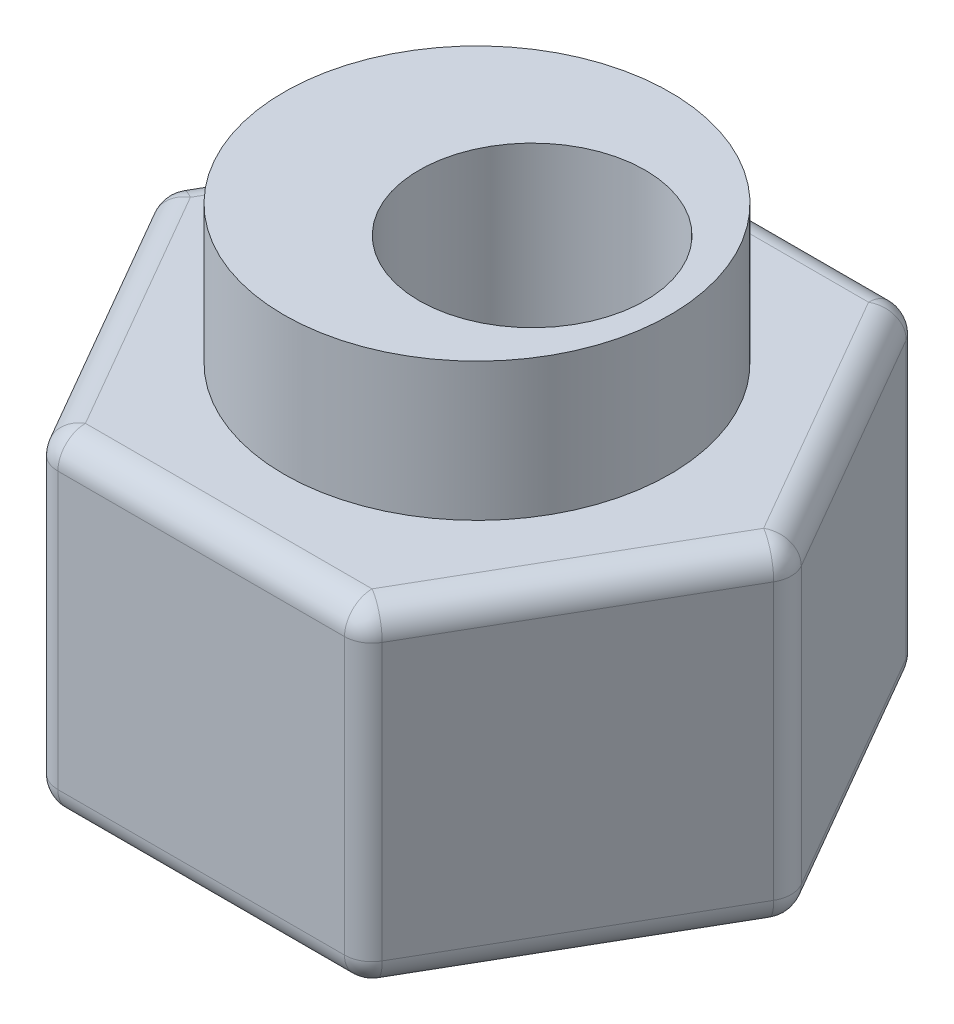
ISO-10303-21;
HEADER;
FILE_DESCRIPTION(('STEP AP214'),'2;1');
FILE_NAME('part.step','',(''),(''),'','','');
FILE_SCHEMA(('AUTOMOTIVE_DESIGN { 1 0 10303 214 1 1 1 1 }'));
ENDSEC;
DATA;
#1=APPLICATION_CONTEXT('core data for automotive mechanical design processes');
#2=APPLICATION_PROTOCOL_DEFINITION('international standard','automotive_design',2000,#1);
#3=PRODUCT_CONTEXT('',#1,'mechanical');
#4=PRODUCT('Part','Part','',(#3));
#5=PRODUCT_RELATED_PRODUCT_CATEGORY('part','',(#4));
#6=PRODUCT_DEFINITION_FORMATION('','',#4);
#7=PRODUCT_DEFINITION_CONTEXT('part definition',#1,'design');
#8=PRODUCT_DEFINITION('design','',#6,#7);
#9=PRODUCT_DEFINITION_SHAPE('','',#8);
#10=(LENGTH_UNIT() NAMED_UNIT(*) SI_UNIT(.MILLI.,.METRE.));
#11=(NAMED_UNIT(*) PLANE_ANGLE_UNIT() SI_UNIT($,.RADIAN.));
#12=(NAMED_UNIT(*) SI_UNIT($,.STERADIAN.) SOLID_ANGLE_UNIT());
#13=UNCERTAINTY_MEASURE_WITH_UNIT(LENGTH_MEASURE(1.E-05),#10,'distance_accuracy_value','');
#14=(GEOMETRIC_REPRESENTATION_CONTEXT(3) GLOBAL_UNCERTAINTY_ASSIGNED_CONTEXT((#13)) GLOBAL_UNIT_ASSIGNED_CONTEXT((#10,
#11,#12)) REPRESENTATION_CONTEXT('',''));
#15=CARTESIAN_POINT('',(0.,0.,0.));
#16=DIRECTION('',(0.,0.,1.));
#17=DIRECTION('',(1.,0.,0.));
#18=AXIS2_PLACEMENT_3D('',#15,#16,#17);
#19=CARTESIAN_POINT('',(2.88675134594813,6.,-5.));
#20=DIRECTION('',(0.,0.,1.));
#21=DIRECTION('',(1.,0.,0.));
#22=AXIS2_PLACEMENT_3D('',#19,#20,#21);
#23=PLANE('',#22);
#24=DIRECTION('',(0.,-1.,0.));
#25=VECTOR('',#24,1.);
#26=CARTESIAN_POINT('',(-2.59807621135332,6.,-5.));
#27=LINE('',#26,#25);
#28=CARTESIAN_POINT('',(-2.59807621135332,0.5,-5.));
#29=VERTEX_POINT('',#28);
#30=CARTESIAN_POINT('',(-2.59807621135332,5.5,-5.));
#31=VERTEX_POINT('',#30);
#32=EDGE_CURVE('E226',#29,#31,#27,.F.);
#33=ORIENTED_EDGE('',*,*,#32,.T.);
#34=DIRECTION('',(-1.,0.,0.));
#35=VECTOR('',#34,1.);
#36=CARTESIAN_POINT('',(2.88675134594813,5.5,-5.));
#37=LINE('',#36,#35);
#38=CARTESIAN_POINT('',(2.59807621135332,5.5,-5.));
#39=VERTEX_POINT('',#38);
#40=EDGE_CURVE('E229',#31,#39,#37,.F.);
#41=ORIENTED_EDGE('',*,*,#40,.T.);
#42=DIRECTION('',(0.,-1.,0.));
#43=VECTOR('',#42,1.);
#44=CARTESIAN_POINT('',(2.59807621135332,6.,-5.));
#45=LINE('',#44,#43);
#46=CARTESIAN_POINT('',(2.59807621135332,0.5,-5.));
#47=VERTEX_POINT('',#46);
#48=EDGE_CURVE('E224',#39,#47,#45,.T.);
#49=ORIENTED_EDGE('',*,*,#48,.T.);
#50=DIRECTION('',(-1.,0.,0.));
#51=VECTOR('',#50,1.);
#52=CARTESIAN_POINT('',(2.88675134594813,0.5,-5.));
#53=LINE('',#52,#51);
#54=EDGE_CURVE('E222',#47,#29,#53,.T.);
#55=ORIENTED_EDGE('',*,*,#54,.T.);
#56=EDGE_LOOP('',(#33,#41,#49,#55));
#57=FACE_BOUND('',#56,.T.);
#58=ADVANCED_FACE('F33',(#57),#23,.F.);
#59=CARTESIAN_POINT('',(-2.88675134594813,6.,-5.));
#60=DIRECTION('',(0.866025403784438,0.,0.5));
#61=DIRECTION('',(0.5,0.,-0.866025403784438));
#62=AXIS2_PLACEMENT_3D('',#59,#60,#61);
#63=PLANE('',#62);
#64=DIRECTION('',(0.,-1.,0.));
#65=VECTOR('',#64,1.);
#66=CARTESIAN_POINT('',(-5.62916512459886,6.,-0.250000000000002));
#67=LINE('',#66,#65);
#68=CARTESIAN_POINT('',(-5.62916512459886,0.5,-0.250000000000003));
#69=VERTEX_POINT('',#68);
#70=CARTESIAN_POINT('',(-5.62916512459886,5.5,-0.250000000000003));
#71=VERTEX_POINT('',#70);
#72=EDGE_CURVE('E217',#69,#71,#67,.F.);
#73=ORIENTED_EDGE('',*,*,#72,.T.);
#74=DIRECTION('',(-0.5,0.,0.866025403784438));
#75=VECTOR('',#74,1.);
#76=CARTESIAN_POINT('',(-2.88675134594813,5.5,-5.));
#77=LINE('',#76,#75);
#78=CARTESIAN_POINT('',(-3.03108891324554,5.5,-4.75));
#79=VERTEX_POINT('',#78);
#80=EDGE_CURVE('E220',#71,#79,#77,.F.);
#81=ORIENTED_EDGE('',*,*,#80,.T.);
#82=DIRECTION('',(0.,-1.,0.));
#83=VECTOR('',#82,1.);
#84=CARTESIAN_POINT('',(-3.03108891324554,6.,-4.75));
#85=LINE('',#84,#83);
#86=CARTESIAN_POINT('',(-3.03108891324554,0.5,-4.75));
#87=VERTEX_POINT('',#86);
#88=EDGE_CURVE('E215',#79,#87,#85,.T.);
#89=ORIENTED_EDGE('',*,*,#88,.T.);
#90=DIRECTION('',(-0.5,0.,0.866025403784438));
#91=VECTOR('',#90,1.);
#92=CARTESIAN_POINT('',(-2.88675134594813,0.5,-5.));
#93=LINE('',#92,#91);
#94=EDGE_CURVE('E213',#87,#69,#93,.T.);
#95=ORIENTED_EDGE('',*,*,#94,.T.);
#96=EDGE_LOOP('',(#73,#81,#89,#95));
#97=FACE_BOUND('',#96,.T.);
#98=ADVANCED_FACE('F388',(#97),#63,.F.);
#99=CARTESIAN_POINT('',(-5.77350269189626,6.,0.));
#100=DIRECTION('',(0.866025403784439,0.,-0.5));
#101=DIRECTION('',(-0.5,0.,-0.866025403784439));
#102=AXIS2_PLACEMENT_3D('',#99,#100,#101);
#103=PLANE('',#102);
#104=DIRECTION('',(0.,-1.,0.));
#105=VECTOR('',#104,1.);
#106=CARTESIAN_POINT('',(-3.03108891324554,6.,4.75));
#107=LINE('',#106,#105);
#108=CARTESIAN_POINT('',(-3.03108891324554,0.5,4.75));
#109=VERTEX_POINT('',#108);
#110=CARTESIAN_POINT('',(-3.03108891324554,5.5,4.75));
#111=VERTEX_POINT('',#110);
#112=EDGE_CURVE('E208',#109,#111,#107,.F.);
#113=ORIENTED_EDGE('',*,*,#112,.T.);
#114=DIRECTION('',(0.5,0.,0.866025403784439));
#115=VECTOR('',#114,1.);
#116=CARTESIAN_POINT('',(-5.77350269189626,5.5,0.));
#117=LINE('',#116,#115);
#118=CARTESIAN_POINT('',(-5.62916512459886,5.5,0.249999999999997));
#119=VERTEX_POINT('',#118);
#120=EDGE_CURVE('E211',#111,#119,#117,.F.);
#121=ORIENTED_EDGE('',*,*,#120,.T.);
#122=DIRECTION('',(0.,-1.,0.));
#123=VECTOR('',#122,1.);
#124=CARTESIAN_POINT('',(-5.62916512459886,6.,0.249999999999997));
#125=LINE('',#124,#123);
#126=CARTESIAN_POINT('',(-5.62916512459886,0.5,0.249999999999997));
#127=VERTEX_POINT('',#126);
#128=EDGE_CURVE('E206',#119,#127,#125,.T.);
#129=ORIENTED_EDGE('',*,*,#128,.T.);
#130=DIRECTION('',(0.5,0.,0.866025403784439));
#131=VECTOR('',#130,1.);
#132=CARTESIAN_POINT('',(-5.77350269189626,0.5,0.));
#133=LINE('',#132,#131);
#134=EDGE_CURVE('E204',#127,#109,#133,.T.);
#135=ORIENTED_EDGE('',*,*,#134,.T.);
#136=EDGE_LOOP('',(#113,#121,#129,#135));
#137=FACE_BOUND('',#136,.T.);
#138=ADVANCED_FACE('F395',(#137),#103,.F.);
#139=CARTESIAN_POINT('',(-2.88675134594813,6.,5.));
#140=DIRECTION('',(0.,0.,-1.));
#141=DIRECTION('',(-1.,0.,0.));
#142=AXIS2_PLACEMENT_3D('',#139,#140,#141);
#143=PLANE('',#142);
#144=DIRECTION('',(0.,-1.,0.));
#145=VECTOR('',#144,1.);
#146=CARTESIAN_POINT('',(2.59807621135332,6.,5.));
#147=LINE('',#146,#145);
#148=CARTESIAN_POINT('',(2.59807621135332,0.5,5.));
#149=VERTEX_POINT('',#148);
#150=CARTESIAN_POINT('',(2.59807621135332,5.5,5.));
#151=VERTEX_POINT('',#150);
#152=EDGE_CURVE('E164',#149,#151,#147,.F.);
#153=ORIENTED_EDGE('',*,*,#152,.T.);
#154=DIRECTION('',(1.,0.,0.));
#155=VECTOR('',#154,1.);
#156=CARTESIAN_POINT('',(-2.88675134594813,5.5,5.));
#157=LINE('',#156,#155);
#158=CARTESIAN_POINT('',(-2.59807621135332,5.5,5.));
#159=VERTEX_POINT('',#158);
#160=EDGE_CURVE('E202',#151,#159,#157,.F.);
#161=ORIENTED_EDGE('',*,*,#160,.T.);
#162=DIRECTION('',(0.,-1.,0.));
#163=VECTOR('',#162,1.);
#164=CARTESIAN_POINT('',(-2.59807621135332,6.,5.));
#165=LINE('',#164,#163);
#166=CARTESIAN_POINT('',(-2.59807621135332,0.5,5.));
#167=VERTEX_POINT('',#166);
#168=EDGE_CURVE('E199',#159,#167,#165,.T.);
#169=ORIENTED_EDGE('',*,*,#168,.T.);
#170=DIRECTION('',(1.,0.,0.));
#171=VECTOR('',#170,1.);
#172=CARTESIAN_POINT('',(-2.88675134594813,0.5,5.));
#173=LINE('',#172,#171);
#174=EDGE_CURVE('E194',#167,#149,#173,.T.);
#175=ORIENTED_EDGE('',*,*,#174,.T.);
#176=EDGE_LOOP('',(#153,#161,#169,#175));
#177=FACE_BOUND('',#176,.T.);
#178=ADVANCED_FACE('F560',(#177),#143,.F.);
#179=CARTESIAN_POINT('',(2.88675134594813,6.,5.));
#180=DIRECTION('',(-0.866025403784439,0.,-0.5));
#181=DIRECTION('',(-0.5,0.,0.866025403784439));
#182=AXIS2_PLACEMENT_3D('',#179,#180,#181);
#183=PLANE('',#182);
#184=DIRECTION('',(0.,-1.,0.));
#185=VECTOR('',#184,1.);
#186=CARTESIAN_POINT('',(5.62916512459886,6.,0.25));
#187=LINE('',#186,#185);
#188=CARTESIAN_POINT('',(5.62916512459886,0.5,0.250000000000002));
#189=VERTEX_POINT('',#188);
#190=CARTESIAN_POINT('',(5.62916512459886,5.5,0.250000000000002));
#191=VERTEX_POINT('',#190);
#192=EDGE_CURVE('E186',#189,#191,#187,.F.);
#193=ORIENTED_EDGE('',*,*,#192,.T.);
#194=DIRECTION('',(0.5,0.,-0.866025403784439));
#195=VECTOR('',#194,1.);
#196=CARTESIAN_POINT('',(2.88675134594813,5.5,5.));
#197=LINE('',#196,#195);
#198=CARTESIAN_POINT('',(3.03108891324554,5.5,4.75));
#199=VERTEX_POINT('',#198);
#200=EDGE_CURVE('E191',#191,#199,#197,.F.);
#201=ORIENTED_EDGE('',*,*,#200,.T.);
#202=DIRECTION('',(0.,-1.,0.));
#203=VECTOR('',#202,1.);
#204=CARTESIAN_POINT('',(3.03108891324554,6.,4.75));
#205=LINE('',#204,#203);
#206=CARTESIAN_POINT('',(3.03108891324554,0.5,4.75));
#207=VERTEX_POINT('',#206);
#208=EDGE_CURVE('E162',#199,#207,#205,.T.);
#209=ORIENTED_EDGE('',*,*,#208,.T.);
#210=DIRECTION('',(0.5,0.,-0.866025403784439));
#211=VECTOR('',#210,1.);
#212=CARTESIAN_POINT('',(2.88675134594813,0.5,5.));
#213=LINE('',#212,#211);
#214=EDGE_CURVE('E180',#207,#189,#213,.T.);
#215=ORIENTED_EDGE('',*,*,#214,.T.);
#216=EDGE_LOOP('',(#193,#201,#209,#215));
#217=FACE_BOUND('',#216,.T.);
#218=ADVANCED_FACE('F189',(#217),#183,.F.);
#219=CARTESIAN_POINT('',(5.77350269189626,6.,0.));
#220=DIRECTION('',(-0.866025403784439,0.,0.5));
#221=DIRECTION('',(0.5,0.,0.866025403784439));
#222=AXIS2_PLACEMENT_3D('',#219,#220,#221);
#223=PLANE('',#222);
#224=DIRECTION('',(0.,-1.,0.));
#225=VECTOR('',#224,1.);
#226=CARTESIAN_POINT('',(3.03108891324554,6.,-4.75));
#227=LINE('',#226,#225);
#228=CARTESIAN_POINT('',(3.03108891324554,0.5,-4.75));
#229=VERTEX_POINT('',#228);
#230=CARTESIAN_POINT('',(3.03108891324554,5.5,-4.75));
#231=VERTEX_POINT('',#230);
#232=EDGE_CURVE('E235',#229,#231,#227,.F.);
#233=ORIENTED_EDGE('',*,*,#232,.T.);
#234=DIRECTION('',(-0.5,0.,-0.866025403784439));
#235=VECTOR('',#234,1.);
#236=CARTESIAN_POINT('',(5.77350269189626,5.5,0.));
#237=LINE('',#236,#235);
#238=CARTESIAN_POINT('',(5.62916512459886,5.5,-0.249999999999998));
#239=VERTEX_POINT('',#238);
#240=EDGE_CURVE('E238',#231,#239,#237,.F.);
#241=ORIENTED_EDGE('',*,*,#240,.T.);
#242=DIRECTION('',(0.,-1.,0.));
#243=VECTOR('',#242,1.);
#244=CARTESIAN_POINT('',(5.62916512459886,6.,-0.249999999999998));
#245=LINE('',#244,#243);
#246=CARTESIAN_POINT('',(5.62916512459886,0.5,-0.249999999999998));
#247=VERTEX_POINT('',#246);
#248=EDGE_CURVE('E233',#239,#247,#245,.T.);
#249=ORIENTED_EDGE('',*,*,#248,.T.);
#250=DIRECTION('',(-0.5,0.,-0.866025403784439));
#251=VECTOR('',#250,1.);
#252=CARTESIAN_POINT('',(5.77350269189626,0.5,0.));
#253=LINE('',#252,#251);
#254=EDGE_CURVE('E231',#247,#229,#253,.T.);
#255=ORIENTED_EDGE('',*,*,#254,.T.);
#256=EDGE_LOOP('',(#233,#241,#249,#255));
#257=FACE_BOUND('',#256,.T.);
#258=ADVANCED_FACE('F376',(#257),#223,.F.);
#259=CARTESIAN_POINT('',(0.,6.,0.));
#260=DIRECTION('',(0.,1.,0.));
#261=DIRECTION('',(0.,0.,1.));
#262=AXIS2_PLACEMENT_3D('',#259,#260,#261);
#263=PLANE('',#262);
#264=DIRECTION('',(1.,0.,0.));
#265=VECTOR('',#264,1.);
#266=CARTESIAN_POINT('',(2.88675134594813,6.,4.5));
#267=LINE('',#266,#265);
#268=CARTESIAN_POINT('',(-2.59807621135332,6.,4.5));
#269=VERTEX_POINT('',#268);
#270=CARTESIAN_POINT('',(2.59807621135332,6.,4.5));
#271=VERTEX_POINT('',#270);
#272=EDGE_CURVE('E248',#269,#271,#267,.T.);
#273=ORIENTED_EDGE('',*,*,#272,.T.);
#274=DIRECTION('',(0.5,0.,-0.866025403784439));
#275=VECTOR('',#274,1.);
#276=CARTESIAN_POINT('',(5.34048999000404,6.,-0.249999999999998));
#277=LINE('',#276,#275);
#278=CARTESIAN_POINT('',(5.19615242270664,6.,0.));
#279=VERTEX_POINT('',#278);
#280=EDGE_CURVE('E250',#271,#279,#277,.T.);
#281=ORIENTED_EDGE('',*,*,#280,.T.);
#282=DIRECTION('',(-0.5,0.,-0.866025403784439));
#283=VECTOR('',#282,1.);
#284=CARTESIAN_POINT('',(2.45373864405591,6.,-4.75));
#285=LINE('',#284,#283);
#286=CARTESIAN_POINT('',(2.59807621135332,6.,-4.5));
#287=VERTEX_POINT('',#286);
#288=EDGE_CURVE('E240',#279,#287,#285,.T.);
#289=ORIENTED_EDGE('',*,*,#288,.T.);
#290=DIRECTION('',(-1.,0.,0.));
#291=VECTOR('',#290,1.);
#292=CARTESIAN_POINT('',(-2.88675134594813,6.,-4.5));
#293=LINE('',#292,#291);
#294=CARTESIAN_POINT('',(-2.59807621135332,6.,-4.5));
#295=VERTEX_POINT('',#294);
#296=EDGE_CURVE('E242',#287,#295,#293,.T.);
#297=ORIENTED_EDGE('',*,*,#296,.T.);
#298=DIRECTION('',(-0.5,0.,0.866025403784438));
#299=VECTOR('',#298,1.);
#300=CARTESIAN_POINT('',(-5.34048999000404,6.,0.249999999999998));
#301=LINE('',#300,#299);
#302=CARTESIAN_POINT('',(-5.19615242270664,6.,0.));
#303=VERTEX_POINT('',#302);
#304=EDGE_CURVE('E244',#295,#303,#301,.T.);
#305=ORIENTED_EDGE('',*,*,#304,.T.);
#306=DIRECTION('',(0.5,0.,0.866025403784439));
#307=VECTOR('',#306,1.);
#308=CARTESIAN_POINT('',(-2.45373864405591,6.,4.75));
#309=LINE('',#308,#307);
#310=EDGE_CURVE('E246',#303,#269,#309,.T.);
#311=ORIENTED_EDGE('',*,*,#310,.T.);
#312=EDGE_LOOP('',(#273,#281,#289,#297,#305,#311));
#313=FACE_BOUND('',#312,.T.);
#314=CARTESIAN_POINT('',(0.,6.,0.));
#315=DIRECTION('',(0.,1.,0.));
#316=DIRECTION('',(0.,0.,1.));
#317=AXIS2_PLACEMENT_3D('',#314,#315,#316);
#318=CIRCLE('',#317,3.5);
#319=CARTESIAN_POINT('',(0.,6.,3.5));
#320=VERTEX_POINT('',#319);
#321=EDGE_CURVE('E187',#320,#320,#318,.T.);
#322=ORIENTED_EDGE('',*,*,#321,.F.);
#323=EDGE_LOOP('',(#322));
#324=FACE_BOUND('',#323,.T.);
#325=ADVANCED_FACE('F373',(#313,#324),#263,.T.);
#326=CARTESIAN_POINT('',(0.,0.,0.));
#327=DIRECTION('',(0.,1.,0.));
#328=DIRECTION('',(0.,0.,1.));
#329=AXIS2_PLACEMENT_3D('',#326,#327,#328);
#330=PLANE('',#329);
#331=DIRECTION('',(-0.5,0.,0.866025403784438));
#332=VECTOR('',#331,1.);
#333=CARTESIAN_POINT('',(-3.89711431702998,0.,-2.25));
#334=LINE('',#333,#332);
#335=CARTESIAN_POINT('',(-5.19615242270664,0.,0.));
#336=VERTEX_POINT('',#335);
#337=CARTESIAN_POINT('',(-2.59807621135332,0.,-4.5));
#338=VERTEX_POINT('',#337);
#339=EDGE_CURVE('E42',#336,#338,#334,.F.);
#340=ORIENTED_EDGE('',*,*,#339,.T.);
#341=DIRECTION('',(-1.,0.,0.));
#342=VECTOR('',#341,1.);
#343=CARTESIAN_POINT('',(0.,0.,-4.5));
#344=LINE('',#343,#342);
#345=CARTESIAN_POINT('',(2.59807621135332,0.,-4.5));
#346=VERTEX_POINT('',#345);
#347=EDGE_CURVE('E11',#338,#346,#344,.F.);
#348=ORIENTED_EDGE('',*,*,#347,.T.);
#349=DIRECTION('',(-0.5,0.,-0.866025403784439));
#350=VECTOR('',#349,1.);
#351=CARTESIAN_POINT('',(3.89711431702998,0.,-2.25));
#352=LINE('',#351,#350);
#353=CARTESIAN_POINT('',(5.19615242270664,0.,0.));
#354=VERTEX_POINT('',#353);
#355=EDGE_CURVE('E253',#346,#354,#352,.F.);
#356=ORIENTED_EDGE('',*,*,#355,.T.);
#357=DIRECTION('',(0.5,0.,-0.866025403784439));
#358=VECTOR('',#357,1.);
#359=CARTESIAN_POINT('',(3.89711431702998,0.,2.25));
#360=LINE('',#359,#358);
#361=CARTESIAN_POINT('',(2.59807621135332,0.,4.5));
#362=VERTEX_POINT('',#361);
#363=EDGE_CURVE('E255',#354,#362,#360,.F.);
#364=ORIENTED_EDGE('',*,*,#363,.T.);
#365=DIRECTION('',(1.,0.,0.));
#366=VECTOR('',#365,1.);
#367=CARTESIAN_POINT('',(0.,0.,4.5));
#368=LINE('',#367,#366);
#369=CARTESIAN_POINT('',(-2.59807621135332,0.,4.5));
#370=VERTEX_POINT('',#369);
#371=EDGE_CURVE('E257',#362,#370,#368,.F.);
#372=ORIENTED_EDGE('',*,*,#371,.T.);
#373=DIRECTION('',(0.5,0.,0.866025403784439));
#374=VECTOR('',#373,1.);
#375=CARTESIAN_POINT('',(-3.89711431702998,0.,2.25));
#376=LINE('',#375,#374);
#377=EDGE_CURVE('E53',#370,#336,#376,.F.);
#378=ORIENTED_EDGE('',*,*,#377,.T.);
#379=EDGE_LOOP('',(#340,#348,#356,#364,#372,#378));
#380=FACE_BOUND('',#379,.T.);
#381=CARTESIAN_POINT('',(1.,0.,0.));
#382=DIRECTION('',(0.,1.,0.));
#383=DIRECTION('',(0.,0.,1.));
#384=AXIS2_PLACEMENT_3D('',#381,#382,#383);
#385=CIRCLE('',#384,2.05);
#386=CARTESIAN_POINT('',(1.,0.,2.05));
#387=VERTEX_POINT('',#386);
#388=EDGE_CURVE('E358',#387,#387,#385,.T.);
#389=ORIENTED_EDGE('',*,*,#388,.T.);
#390=EDGE_LOOP('',(#389));
#391=FACE_BOUND('',#390,.T.);
#392=ADVANCED_FACE('F375',(#380,#391),#330,.F.);
#393=CARTESIAN_POINT('',(0.,8.5,0.));
#394=DIRECTION('',(0.,-1.,0.));
#395=DIRECTION('',(0.,0.,-1.));
#396=AXIS2_PLACEMENT_3D('',#393,#394,#395);
#397=CYLINDRICAL_SURFACE('',#396,3.5);
#398=CARTESIAN_POINT('',(0.,8.5,0.));
#399=DIRECTION('',(0.,1.,0.));
#400=DIRECTION('',(0.,0.,1.));
#401=AXIS2_PLACEMENT_3D('',#398,#399,#400);
#402=CIRCLE('',#401,3.5);
#403=CARTESIAN_POINT('',(0.,8.5,3.5));
#404=VERTEX_POINT('',#403);
#405=EDGE_CURVE('E363',#404,#404,#402,.T.);
#406=ORIENTED_EDGE('',*,*,#405,.F.);
#407=EDGE_LOOP('',(#406));
#408=FACE_BOUND('',#407,.T.);
#409=ORIENTED_EDGE('',*,*,#321,.T.);
#410=EDGE_LOOP('',(#409));
#411=FACE_BOUND('',#410,.T.);
#412=ADVANCED_FACE('F371',(#408,#411),#397,.T.);
#413=CARTESIAN_POINT('',(0.,8.5,0.));
#414=DIRECTION('',(0.,1.,0.));
#415=DIRECTION('',(0.,0.,1.));
#416=AXIS2_PLACEMENT_3D('',#413,#414,#415);
#417=PLANE('',#416);
#418=CARTESIAN_POINT('',(1.,8.5,0.));
#419=DIRECTION('',(0.,1.,0.));
#420=DIRECTION('',(0.,0.,1.));
#421=AXIS2_PLACEMENT_3D('',#418,#419,#420);
#422=CIRCLE('',#421,2.05);
#423=CARTESIAN_POINT('',(1.,8.5,2.05));
#424=VERTEX_POINT('',#423);
#425=EDGE_CURVE('E352',#424,#424,#422,.T.);
#426=ORIENTED_EDGE('',*,*,#425,.F.);
#427=EDGE_LOOP('',(#426));
#428=FACE_BOUND('',#427,.T.);
#429=ORIENTED_EDGE('',*,*,#405,.T.);
#430=EDGE_LOOP('',(#429));
#431=FACE_BOUND('',#430,.T.);
#432=ADVANCED_FACE('F600',(#428,#431),#417,.T.);
#433=CARTESIAN_POINT('',(1.,0.,0.));
#434=DIRECTION('',(0.,1.,0.));
#435=DIRECTION('',(0.,0.,1.));
#436=AXIS2_PLACEMENT_3D('',#433,#434,#435);
#437=CYLINDRICAL_SURFACE('',#436,2.05);
#438=ORIENTED_EDGE('',*,*,#388,.F.);
#439=EDGE_LOOP('',(#438));
#440=FACE_BOUND('',#439,.T.);
#441=ORIENTED_EDGE('',*,*,#425,.T.);
#442=EDGE_LOOP('',(#441));
#443=FACE_BOUND('',#442,.T.);
#444=ADVANCED_FACE('F509',(#440,#443),#437,.F.);
#445=CARTESIAN_POINT('',(-2.59807621135332,6.,-4.5));
#446=DIRECTION('',(0.,-1.,0.));
#447=DIRECTION('',(0.,0.,-1.));
#448=AXIS2_PLACEMENT_3D('',#445,#446,#447);
#449=CYLINDRICAL_SURFACE('',#448,0.5);
#450=CARTESIAN_POINT('',(-2.59807621135332,5.5,-4.5));
#451=DIRECTION('',(0.,1.,0.));
#452=DIRECTION('',(0.,0.,1.));
#453=AXIS2_PLACEMENT_3D('',#450,#451,#452);
#454=CIRCLE('',#453,0.5);
#455=EDGE_CURVE('E37',#31,#79,#454,.T.);
#456=ORIENTED_EDGE('',*,*,#455,.F.);
#457=ORIENTED_EDGE('',*,*,#32,.F.);
#458=CARTESIAN_POINT('',(-2.59807621135332,0.5,-4.5));
#459=DIRECTION('',(0.,-1.,0.));
#460=DIRECTION('',(0.,0.,-1.));
#461=AXIS2_PLACEMENT_3D('',#458,#459,#460);
#462=CIRCLE('',#461,0.5);
#463=EDGE_CURVE('E345',#87,#29,#462,.T.);
#464=ORIENTED_EDGE('',*,*,#463,.F.);
#465=ORIENTED_EDGE('',*,*,#88,.F.);
#466=EDGE_LOOP('',(#456,#457,#464,#465));
#467=FACE_BOUND('',#466,.T.);
#468=ADVANCED_FACE('F35',(#467),#449,.T.);
#469=CARTESIAN_POINT('',(-2.59807621135332,5.5,-4.5));
#470=DIRECTION('',(0.,0.,1.));
#471=DIRECTION('',(1.,0.,0.));
#472=AXIS2_PLACEMENT_3D('',#469,#470,#471);
#473=SPHERICAL_SURFACE('',#472,0.5);
#474=CARTESIAN_POINT('',(-2.59807621135332,5.5,-4.5));
#475=DIRECTION('',(-1.,0.,0.));
#476=DIRECTION('',(0.,0.,1.));
#477=AXIS2_PLACEMENT_3D('',#474,#475,#476);
#478=CIRCLE('',#477,0.5);
#479=EDGE_CURVE('E340',#31,#295,#478,.F.);
#480=ORIENTED_EDGE('',*,*,#479,.F.);
#481=ORIENTED_EDGE('',*,*,#455,.T.);
#482=CARTESIAN_POINT('',(-2.59807621135332,5.5,-4.5));
#483=DIRECTION('',(0.500000000000001,0.,-0.866025403784438));
#484=DIRECTION('',(-0.866025403784438,0.,-0.500000000000001));
#485=AXIS2_PLACEMENT_3D('',#482,#483,#484);
#486=CIRCLE('',#485,0.5);
#487=EDGE_CURVE('E343',#295,#79,#486,.F.);
#488=ORIENTED_EDGE('',*,*,#487,.F.);
#489=EDGE_LOOP('',(#480,#481,#488));
#490=FACE_BOUND('',#489,.T.);
#491=ADVANCED_FACE('F504',(#490),#473,.T.);
#492=CARTESIAN_POINT('',(-2.59807621135332,0.5,-4.5));
#493=DIRECTION('',(0.,0.,1.));
#494=DIRECTION('',(1.,0.,0.));
#495=AXIS2_PLACEMENT_3D('',#492,#493,#494);
#496=SPHERICAL_SURFACE('',#495,0.5);
#497=CARTESIAN_POINT('',(-2.59807621135332,0.5,-4.5));
#498=DIRECTION('',(0.5,0.,-0.866025403784438));
#499=DIRECTION('',(-0.866025403784438,0.,-0.5));
#500=AXIS2_PLACEMENT_3D('',#497,#498,#499);
#501=CIRCLE('',#500,0.5);
#502=EDGE_CURVE('E335',#87,#338,#501,.F.);
#503=ORIENTED_EDGE('',*,*,#502,.F.);
#504=ORIENTED_EDGE('',*,*,#463,.T.);
#505=CARTESIAN_POINT('',(-2.59807621135332,0.5,-4.5));
#506=DIRECTION('',(-1.,0.,0.));
#507=DIRECTION('',(0.,0.,1.));
#508=AXIS2_PLACEMENT_3D('',#505,#506,#507);
#509=CIRCLE('',#508,0.5);
#510=EDGE_CURVE('E337',#338,#29,#509,.F.);
#511=ORIENTED_EDGE('',*,*,#510,.F.);
#512=EDGE_LOOP('',(#503,#504,#511));
#513=FACE_BOUND('',#512,.T.);
#514=ADVANCED_FACE('F501',(#513),#496,.T.);
#515=CARTESIAN_POINT('',(-3.89711431702998,5.5,-2.25));
#516=DIRECTION('',(0.5,0.,-0.866025403784438));
#517=DIRECTION('',(-0.866025403784438,0.,-0.5));
#518=AXIS2_PLACEMENT_3D('',#515,#516,#517);
#519=CYLINDRICAL_SURFACE('',#518,0.5);
#520=ORIENTED_EDGE('',*,*,#487,.T.);
#521=ORIENTED_EDGE('',*,*,#80,.F.);
#522=CARTESIAN_POINT('',(-5.19615242270664,5.5,0.));
#523=DIRECTION('',(-0.499999999999998,0.,0.86602540378444));
#524=DIRECTION('',(0.86602540378444,0.,0.499999999999998));
#525=AXIS2_PLACEMENT_3D('',#522,#523,#524);
#526=CIRCLE('',#525,0.5);
#527=EDGE_CURVE('E330',#303,#71,#526,.T.);
#528=ORIENTED_EDGE('',*,*,#527,.F.);
#529=ORIENTED_EDGE('',*,*,#304,.F.);
#530=EDGE_LOOP('',(#520,#521,#528,#529));
#531=FACE_BOUND('',#530,.T.);
#532=ADVANCED_FACE('F497',(#531),#519,.T.);
#533=CARTESIAN_POINT('',(0.,5.5,-4.5));
#534=DIRECTION('',(1.,0.,0.));
#535=DIRECTION('',(0.,0.,-1.));
#536=AXIS2_PLACEMENT_3D('',#533,#534,#535);
#537=CYLINDRICAL_SURFACE('',#536,0.5);
#538=ORIENTED_EDGE('',*,*,#479,.T.);
#539=ORIENTED_EDGE('',*,*,#296,.F.);
#540=CARTESIAN_POINT('',(2.59807621135332,5.5,-4.5));
#541=DIRECTION('',(1.,0.,0.));
#542=DIRECTION('',(0.,0.,-1.));
#543=AXIS2_PLACEMENT_3D('',#540,#541,#542);
#544=CIRCLE('',#543,0.5);
#545=EDGE_CURVE('E327',#39,#287,#544,.T.);
#546=ORIENTED_EDGE('',*,*,#545,.F.);
#547=ORIENTED_EDGE('',*,*,#40,.F.);
#548=EDGE_LOOP('',(#538,#539,#546,#547));
#549=FACE_BOUND('',#548,.T.);
#550=ADVANCED_FACE('F493',(#549),#537,.T.);
#551=CARTESIAN_POINT('',(2.59807621135332,6.,-4.5));
#552=DIRECTION('',(0.,-1.,0.));
#553=DIRECTION('',(0.,0.,-1.));
#554=AXIS2_PLACEMENT_3D('',#551,#552,#553);
#555=CYLINDRICAL_SURFACE('',#554,0.5);
#556=CARTESIAN_POINT('',(2.59807621135332,0.5,-4.5));
#557=DIRECTION('',(0.,-1.,0.));
#558=DIRECTION('',(0.,0.,-1.));
#559=AXIS2_PLACEMENT_3D('',#556,#557,#558);
#560=CIRCLE('',#559,0.5);
#561=EDGE_CURVE('E321',#47,#229,#560,.T.);
#562=ORIENTED_EDGE('',*,*,#561,.F.);
#563=ORIENTED_EDGE('',*,*,#48,.F.);
#564=CARTESIAN_POINT('',(2.59807621135332,5.5,-4.5));
#565=DIRECTION('',(0.,1.,0.));
#566=DIRECTION('',(0.,0.,1.));
#567=AXIS2_PLACEMENT_3D('',#564,#565,#566);
#568=CIRCLE('',#567,0.5);
#569=EDGE_CURVE('E324',#231,#39,#568,.T.);
#570=ORIENTED_EDGE('',*,*,#569,.F.);
#571=ORIENTED_EDGE('',*,*,#232,.F.);
#572=EDGE_LOOP('',(#562,#563,#570,#571));
#573=FACE_BOUND('',#572,.T.);
#574=ADVANCED_FACE('F489',(#573),#555,.T.);
#575=CARTESIAN_POINT('',(2.88675134594813,0.5,-4.5));
#576=DIRECTION('',(-1.,0.,0.));
#577=DIRECTION('',(0.,0.,1.));
#578=AXIS2_PLACEMENT_3D('',#575,#576,#577);
#579=CYLINDRICAL_SURFACE('',#578,0.5);
#580=ORIENTED_EDGE('',*,*,#510,.T.);
#581=ORIENTED_EDGE('',*,*,#54,.F.);
#582=CARTESIAN_POINT('',(2.59807621135332,0.5,-4.5));
#583=DIRECTION('',(1.,0.,0.));
#584=DIRECTION('',(0.,0.,-1.));
#585=AXIS2_PLACEMENT_3D('',#582,#583,#584);
#586=CIRCLE('',#585,0.5);
#587=EDGE_CURVE('E318',#346,#47,#586,.T.);
#588=ORIENTED_EDGE('',*,*,#587,.F.);
#589=ORIENTED_EDGE('',*,*,#347,.F.);
#590=EDGE_LOOP('',(#580,#581,#588,#589));
#591=FACE_BOUND('',#590,.T.);
#592=ADVANCED_FACE('F485',(#591),#579,.T.);
#593=CARTESIAN_POINT('',(-2.45373864405591,0.5,-4.75));
#594=DIRECTION('',(-0.5,0.,0.866025403784438));
#595=DIRECTION('',(0.866025403784438,0.,0.5));
#596=AXIS2_PLACEMENT_3D('',#593,#594,#595);
#597=CYLINDRICAL_SURFACE('',#596,0.5);
#598=ORIENTED_EDGE('',*,*,#502,.T.);
#599=ORIENTED_EDGE('',*,*,#339,.F.);
#600=CARTESIAN_POINT('',(-5.19615242270664,0.5,0.));
#601=DIRECTION('',(-0.500000000000001,0.,0.866025403784438));
#602=DIRECTION('',(0.866025403784438,0.,0.500000000000001));
#603=AXIS2_PLACEMENT_3D('',#600,#601,#602);
#604=CIRCLE('',#603,0.5);
#605=EDGE_CURVE('E315',#69,#336,#604,.T.);
#606=ORIENTED_EDGE('',*,*,#605,.F.);
#607=ORIENTED_EDGE('',*,*,#94,.F.);
#608=EDGE_LOOP('',(#598,#599,#606,#607));
#609=FACE_BOUND('',#608,.T.);
#610=ADVANCED_FACE('F481',(#609),#597,.T.);
#611=CARTESIAN_POINT('',(-5.19615242270664,6.,0.));
#612=DIRECTION('',(0.,-1.,0.));
#613=DIRECTION('',(0.,0.,-1.));
#614=AXIS2_PLACEMENT_3D('',#611,#612,#613);
#615=CYLINDRICAL_SURFACE('',#614,0.5);
#616=CARTESIAN_POINT('',(-5.19615242270664,5.5,0.));
#617=DIRECTION('',(0.,1.,0.));
#618=DIRECTION('',(0.,0.,1.));
#619=AXIS2_PLACEMENT_3D('',#616,#617,#618);
#620=CIRCLE('',#619,0.5);
#621=EDGE_CURVE('E332',#71,#119,#620,.T.);
#622=ORIENTED_EDGE('',*,*,#621,.F.);
#623=ORIENTED_EDGE('',*,*,#72,.F.);
#624=CARTESIAN_POINT('',(-5.19615242270664,0.5,0.));
#625=DIRECTION('',(0.,-1.,0.));
#626=DIRECTION('',(0.,0.,-1.));
#627=AXIS2_PLACEMENT_3D('',#624,#625,#626);
#628=CIRCLE('',#627,0.5);
#629=EDGE_CURVE('E312',#127,#69,#628,.T.);
#630=ORIENTED_EDGE('',*,*,#629,.F.);
#631=ORIENTED_EDGE('',*,*,#128,.F.);
#632=EDGE_LOOP('',(#622,#623,#630,#631));
#633=FACE_BOUND('',#632,.T.);
#634=ADVANCED_FACE('F477',(#633),#615,.T.);
#635=CARTESIAN_POINT('',(-5.19615242270664,5.5,0.));
#636=DIRECTION('',(0.,0.,1.));
#637=DIRECTION('',(1.,0.,0.));
#638=AXIS2_PLACEMENT_3D('',#635,#636,#637);
#639=SPHERICAL_SURFACE('',#638,0.5);
#640=ORIENTED_EDGE('',*,*,#527,.T.);
#641=ORIENTED_EDGE('',*,*,#621,.T.);
#642=CARTESIAN_POINT('',(-5.19615242270664,5.5,0.));
#643=DIRECTION('',(-0.5,0.,-0.866025403784439));
#644=DIRECTION('',(-0.866025403784439,0.,0.5));
#645=AXIS2_PLACEMENT_3D('',#642,#643,#644);
#646=CIRCLE('',#645,0.5);
#647=EDGE_CURVE('E309',#303,#119,#646,.F.);
#648=ORIENTED_EDGE('',*,*,#647,.F.);
#649=EDGE_LOOP('',(#640,#641,#648));
#650=FACE_BOUND('',#649,.T.);
#651=ADVANCED_FACE('F473',(#650),#639,.T.);
#652=CARTESIAN_POINT('',(2.59807621135332,5.5,-4.5));
#653=DIRECTION('',(0.,0.,1.));
#654=DIRECTION('',(1.,0.,0.));
#655=AXIS2_PLACEMENT_3D('',#652,#653,#654);
#656=SPHERICAL_SURFACE('',#655,0.5);
#657=ORIENTED_EDGE('',*,*,#569,.T.);
#658=ORIENTED_EDGE('',*,*,#545,.T.);
#659=CARTESIAN_POINT('',(2.59807621135332,5.5,-4.5));
#660=DIRECTION('',(-0.500000000000001,0.,-0.866025403784438));
#661=DIRECTION('',(-0.866025403784438,0.,0.500000000000001));
#662=AXIS2_PLACEMENT_3D('',#659,#660,#661);
#663=CIRCLE('',#662,0.5);
#664=EDGE_CURVE('E306',#231,#287,#663,.F.);
#665=ORIENTED_EDGE('',*,*,#664,.F.);
#666=EDGE_LOOP('',(#657,#658,#665));
#667=FACE_BOUND('',#666,.T.);
#668=ADVANCED_FACE('F469',(#667),#656,.T.);
#669=CARTESIAN_POINT('',(2.59807621135332,0.5,-4.5));
#670=DIRECTION('',(0.,0.,1.));
#671=DIRECTION('',(1.,0.,0.));
#672=AXIS2_PLACEMENT_3D('',#669,#670,#671);
#673=SPHERICAL_SURFACE('',#672,0.5);
#674=ORIENTED_EDGE('',*,*,#587,.T.);
#675=ORIENTED_EDGE('',*,*,#561,.T.);
#676=CARTESIAN_POINT('',(2.59807621135332,0.5,-4.5));
#677=DIRECTION('',(-0.500000000000001,0.,-0.866025403784438));
#678=DIRECTION('',(-0.866025403784438,0.,0.500000000000001));
#679=AXIS2_PLACEMENT_3D('',#676,#677,#678);
#680=CIRCLE('',#679,0.5);
#681=EDGE_CURVE('E303',#346,#229,#680,.F.);
#682=ORIENTED_EDGE('',*,*,#681,.F.);
#683=EDGE_LOOP('',(#674,#675,#682));
#684=FACE_BOUND('',#683,.T.);
#685=ADVANCED_FACE('F465',(#684),#673,.T.);
#686=CARTESIAN_POINT('',(-5.19615242270664,0.5,0.));
#687=DIRECTION('',(0.,0.,1.));
#688=DIRECTION('',(1.,0.,0.));
#689=AXIS2_PLACEMENT_3D('',#686,#687,#688);
#690=SPHERICAL_SURFACE('',#689,0.5);
#691=ORIENTED_EDGE('',*,*,#629,.T.);
#692=ORIENTED_EDGE('',*,*,#605,.T.);
#693=CARTESIAN_POINT('',(-5.19615242270664,0.5,0.));
#694=DIRECTION('',(-0.5,0.,-0.866025403784439));
#695=DIRECTION('',(-0.866025403784439,0.,0.5));
#696=AXIS2_PLACEMENT_3D('',#693,#694,#695);
#697=CIRCLE('',#696,0.5);
#698=EDGE_CURVE('E300',#127,#336,#697,.F.);
#699=ORIENTED_EDGE('',*,*,#698,.F.);
#700=EDGE_LOOP('',(#691,#692,#699));
#701=FACE_BOUND('',#700,.T.);
#702=ADVANCED_FACE('F461',(#701),#690,.T.);
#703=CARTESIAN_POINT('',(-3.89711431702998,5.5,2.25));
#704=DIRECTION('',(-0.5,0.,-0.866025403784439));
#705=DIRECTION('',(-0.866025403784439,0.,0.5));
#706=AXIS2_PLACEMENT_3D('',#703,#704,#705);
#707=CYLINDRICAL_SURFACE('',#706,0.5);
#708=ORIENTED_EDGE('',*,*,#647,.T.);
#709=ORIENTED_EDGE('',*,*,#120,.F.);
#710=CARTESIAN_POINT('',(-2.59807621135332,5.5,4.5));
#711=DIRECTION('',(0.5,0.,0.866025403784439));
#712=DIRECTION('',(0.866025403784439,0.,-0.5));
#713=AXIS2_PLACEMENT_3D('',#710,#711,#712);
#714=CIRCLE('',#713,0.5);
#715=EDGE_CURVE('E295',#269,#111,#714,.T.);
#716=ORIENTED_EDGE('',*,*,#715,.F.);
#717=ORIENTED_EDGE('',*,*,#310,.F.);
#718=EDGE_LOOP('',(#708,#709,#716,#717));
#719=FACE_BOUND('',#718,.T.);
#720=ADVANCED_FACE('F457',(#719),#707,.T.);
#721=CARTESIAN_POINT('',(3.89711431702998,5.5,-2.25));
#722=DIRECTION('',(0.5,0.,0.866025403784439));
#723=DIRECTION('',(0.866025403784439,0.,-0.5));
#724=AXIS2_PLACEMENT_3D('',#721,#722,#723);
#725=CYLINDRICAL_SURFACE('',#724,0.5);
#726=ORIENTED_EDGE('',*,*,#664,.T.);
#727=ORIENTED_EDGE('',*,*,#288,.F.);
#728=CARTESIAN_POINT('',(5.19615242270664,5.5,0.));
#729=DIRECTION('',(0.499999999999999,0.,0.866025403784439));
#730=DIRECTION('',(0.866025403784439,0.,-0.5));
#731=AXIS2_PLACEMENT_3D('',#728,#729,#730);
#732=CIRCLE('',#731,0.5);
#733=EDGE_CURVE('E292',#239,#279,#732,.T.);
#734=ORIENTED_EDGE('',*,*,#733,.F.);
#735=ORIENTED_EDGE('',*,*,#240,.F.);
#736=EDGE_LOOP('',(#726,#727,#734,#735));
#737=FACE_BOUND('',#736,.T.);
#738=ADVANCED_FACE('F453',(#737),#725,.T.);
#739=CARTESIAN_POINT('',(5.19615242270664,6.,0.));
#740=DIRECTION('',(0.,-1.,0.));
#741=DIRECTION('',(0.,0.,-1.));
#742=AXIS2_PLACEMENT_3D('',#739,#740,#741);
#743=CYLINDRICAL_SURFACE('',#742,0.5);
#744=CARTESIAN_POINT('',(5.19615242270664,0.5,0.));
#745=DIRECTION('',(0.,-1.,0.));
#746=DIRECTION('',(0.,0.,-1.));
#747=AXIS2_PLACEMENT_3D('',#744,#745,#746);
#748=CIRCLE('',#747,0.5);
#749=EDGE_CURVE('E286',#247,#189,#748,.T.);
#750=ORIENTED_EDGE('',*,*,#749,.F.);
#751=ORIENTED_EDGE('',*,*,#248,.F.);
#752=CARTESIAN_POINT('',(5.19615242270664,5.5,0.));
#753=DIRECTION('',(0.,1.,0.));
#754=DIRECTION('',(0.,0.,1.));
#755=AXIS2_PLACEMENT_3D('',#752,#753,#754);
#756=CIRCLE('',#755,0.5);
#757=EDGE_CURVE('E289',#191,#239,#756,.T.);
#758=ORIENTED_EDGE('',*,*,#757,.F.);
#759=ORIENTED_EDGE('',*,*,#192,.F.);
#760=EDGE_LOOP('',(#750,#751,#758,#759));
#761=FACE_BOUND('',#760,.T.);
#762=ADVANCED_FACE('F449',(#761),#743,.T.);
#763=CARTESIAN_POINT('',(5.34048999000404,0.5,0.250000000000001));
#764=DIRECTION('',(-0.5,0.,-0.866025403784439));
#765=DIRECTION('',(-0.866025403784439,0.,0.5));
#766=AXIS2_PLACEMENT_3D('',#763,#764,#765);
#767=CYLINDRICAL_SURFACE('',#766,0.5);
#768=ORIENTED_EDGE('',*,*,#681,.T.);
#769=ORIENTED_EDGE('',*,*,#254,.F.);
#770=CARTESIAN_POINT('',(5.19615242270664,0.5,0.));
#771=DIRECTION('',(0.499999999999998,0.,0.86602540378444));
#772=DIRECTION('',(0.86602540378444,0.,-0.499999999999998));
#773=AXIS2_PLACEMENT_3D('',#770,#771,#772);
#774=CIRCLE('',#773,0.5);
#775=EDGE_CURVE('E283',#354,#247,#774,.T.);
#776=ORIENTED_EDGE('',*,*,#775,.F.);
#777=ORIENTED_EDGE('',*,*,#355,.F.);
#778=EDGE_LOOP('',(#768,#769,#776,#777));
#779=FACE_BOUND('',#778,.T.);
#780=ADVANCED_FACE('F445',(#779),#767,.T.);
#781=CARTESIAN_POINT('',(-5.34048999000404,0.5,-0.250000000000002));
#782=DIRECTION('',(0.5,0.,0.866025403784439));
#783=DIRECTION('',(0.866025403784439,0.,-0.5));
#784=AXIS2_PLACEMENT_3D('',#781,#782,#783);
#785=CYLINDRICAL_SURFACE('',#784,0.5);
#786=ORIENTED_EDGE('',*,*,#698,.T.);
#787=ORIENTED_EDGE('',*,*,#377,.F.);
#788=CARTESIAN_POINT('',(-2.59807621135332,0.5,4.5));
#789=DIRECTION('',(0.500000000000001,0.,0.866025403784438));
#790=DIRECTION('',(0.866025403784438,0.,-0.500000000000001));
#791=AXIS2_PLACEMENT_3D('',#788,#789,#790);
#792=CIRCLE('',#791,0.5);
#793=EDGE_CURVE('E280',#109,#370,#792,.T.);
#794=ORIENTED_EDGE('',*,*,#793,.F.);
#795=ORIENTED_EDGE('',*,*,#134,.F.);
#796=EDGE_LOOP('',(#786,#787,#794,#795));
#797=FACE_BOUND('',#796,.T.);
#798=ADVANCED_FACE('F441',(#797),#785,.T.);
#799=CARTESIAN_POINT('',(-2.59807621135332,6.,4.5));
#800=DIRECTION('',(0.,-1.,0.));
#801=DIRECTION('',(0.,0.,-1.));
#802=AXIS2_PLACEMENT_3D('',#799,#800,#801);
#803=CYLINDRICAL_SURFACE('',#802,0.5);
#804=CARTESIAN_POINT('',(-2.59807621135332,5.5,4.5));
#805=DIRECTION('',(0.,1.,0.));
#806=DIRECTION('',(0.,0.,1.));
#807=AXIS2_PLACEMENT_3D('',#804,#805,#806);
#808=CIRCLE('',#807,0.5);
#809=EDGE_CURVE('E297',#111,#159,#808,.T.);
#810=ORIENTED_EDGE('',*,*,#809,.F.);
#811=ORIENTED_EDGE('',*,*,#112,.F.);
#812=CARTESIAN_POINT('',(-2.59807621135332,0.5,4.5));
#813=DIRECTION('',(0.,-1.,0.));
#814=DIRECTION('',(0.,0.,-1.));
#815=AXIS2_PLACEMENT_3D('',#812,#813,#814);
#816=CIRCLE('',#815,0.5);
#817=EDGE_CURVE('E277',#167,#109,#816,.T.);
#818=ORIENTED_EDGE('',*,*,#817,.F.);
#819=ORIENTED_EDGE('',*,*,#168,.F.);
#820=EDGE_LOOP('',(#810,#811,#818,#819));
#821=FACE_BOUND('',#820,.T.);
#822=ADVANCED_FACE('F437',(#821),#803,.T.);
#823=CARTESIAN_POINT('',(-2.59807621135332,5.5,4.5));
#824=DIRECTION('',(0.,0.,1.));
#825=DIRECTION('',(1.,0.,0.));
#826=AXIS2_PLACEMENT_3D('',#823,#824,#825);
#827=SPHERICAL_SURFACE('',#826,0.5);
#828=ORIENTED_EDGE('',*,*,#715,.T.);
#829=ORIENTED_EDGE('',*,*,#809,.T.);
#830=CARTESIAN_POINT('',(-2.59807621135332,5.5,4.5));
#831=DIRECTION('',(-1.,0.,0.));
#832=DIRECTION('',(0.,-1.,0.));
#833=AXIS2_PLACEMENT_3D('',#830,#831,#832);
#834=CIRCLE('',#833,0.5);
#835=EDGE_CURVE('E274',#269,#159,#834,.F.);
#836=ORIENTED_EDGE('',*,*,#835,.F.);
#837=EDGE_LOOP('',(#828,#829,#836));
#838=FACE_BOUND('',#837,.T.);
#839=ADVANCED_FACE('F433',(#838),#827,.T.);
#840=CARTESIAN_POINT('',(5.19615242270664,5.5,0.));
#841=DIRECTION('',(0.,0.,1.));
#842=DIRECTION('',(1.,0.,0.));
#843=AXIS2_PLACEMENT_3D('',#840,#841,#842);
#844=SPHERICAL_SURFACE('',#843,0.5);
#845=ORIENTED_EDGE('',*,*,#757,.T.);
#846=ORIENTED_EDGE('',*,*,#733,.T.);
#847=CARTESIAN_POINT('',(5.19615242270664,5.5,0.));
#848=DIRECTION('',(0.5,0.,-0.866025403784439));
#849=DIRECTION('',(-0.866025403784439,0.,-0.5));
#850=AXIS2_PLACEMENT_3D('',#847,#848,#849);
#851=CIRCLE('',#850,0.5);
#852=EDGE_CURVE('E272',#191,#279,#851,.F.);
#853=ORIENTED_EDGE('',*,*,#852,.F.);
#854=EDGE_LOOP('',(#845,#846,#853));
#855=FACE_BOUND('',#854,.T.);
#856=ADVANCED_FACE('F429',(#855),#844,.T.);
#857=CARTESIAN_POINT('',(5.19615242270664,0.5,0.));
#858=DIRECTION('',(0.,0.,1.));
#859=DIRECTION('',(1.,0.,0.));
#860=AXIS2_PLACEMENT_3D('',#857,#858,#859);
#861=SPHERICAL_SURFACE('',#860,0.5);
#862=ORIENTED_EDGE('',*,*,#775,.T.);
#863=ORIENTED_EDGE('',*,*,#749,.T.);
#864=CARTESIAN_POINT('',(5.19615242270664,0.5,0.));
#865=DIRECTION('',(0.5,0.,-0.866025403784439));
#866=DIRECTION('',(-0.866025403784439,0.,-0.5));
#867=AXIS2_PLACEMENT_3D('',#864,#865,#866);
#868=CIRCLE('',#867,0.5);
#869=EDGE_CURVE('E183',#354,#189,#868,.F.);
#870=ORIENTED_EDGE('',*,*,#869,.F.);
#871=EDGE_LOOP('',(#862,#863,#870));
#872=FACE_BOUND('',#871,.T.);
#873=ADVANCED_FACE('F425',(#872),#861,.T.);
#874=CARTESIAN_POINT('',(-2.59807621135332,0.5,4.5));
#875=DIRECTION('',(0.,0.,1.));
#876=DIRECTION('',(1.,0.,0.));
#877=AXIS2_PLACEMENT_3D('',#874,#875,#876);
#878=SPHERICAL_SURFACE('',#877,0.5);
#879=ORIENTED_EDGE('',*,*,#817,.T.);
#880=ORIENTED_EDGE('',*,*,#793,.T.);
#881=CARTESIAN_POINT('',(-2.59807621135332,0.5,4.5));
#882=DIRECTION('',(-1.,0.,0.));
#883=DIRECTION('',(0.,0.,1.));
#884=AXIS2_PLACEMENT_3D('',#881,#882,#883);
#885=CIRCLE('',#884,0.5);
#886=EDGE_CURVE('E268',#167,#370,#885,.F.);
#887=ORIENTED_EDGE('',*,*,#886,.F.);
#888=EDGE_LOOP('',(#879,#880,#887));
#889=FACE_BOUND('',#888,.T.);
#890=ADVANCED_FACE('F421',(#889),#878,.T.);
#891=CARTESIAN_POINT('',(0.,5.5,4.5));
#892=DIRECTION('',(-1.,0.,0.));
#893=DIRECTION('',(0.,0.,1.));
#894=AXIS2_PLACEMENT_3D('',#891,#892,#893);
#895=CYLINDRICAL_SURFACE('',#894,0.5);
#896=ORIENTED_EDGE('',*,*,#835,.T.);
#897=ORIENTED_EDGE('',*,*,#160,.F.);
#898=CARTESIAN_POINT('',(2.59807621135332,5.5,4.5));
#899=DIRECTION('',(1.,0.,0.));
#900=DIRECTION('',(0.,0.,-1.));
#901=AXIS2_PLACEMENT_3D('',#898,#899,#900);
#902=CIRCLE('',#901,0.5);
#903=EDGE_CURVE('E265',#271,#151,#902,.T.);
#904=ORIENTED_EDGE('',*,*,#903,.F.);
#905=ORIENTED_EDGE('',*,*,#272,.F.);
#906=EDGE_LOOP('',(#896,#897,#904,#905));
#907=FACE_BOUND('',#906,.T.);
#908=ADVANCED_FACE('F417',(#907),#895,.T.);
#909=CARTESIAN_POINT('',(3.89711431702998,5.5,2.25));
#910=DIRECTION('',(-0.5,0.,0.866025403784439));
#911=DIRECTION('',(0.866025403784439,0.,0.5));
#912=AXIS2_PLACEMENT_3D('',#909,#910,#911);
#913=CYLINDRICAL_SURFACE('',#912,0.5);
#914=ORIENTED_EDGE('',*,*,#852,.T.);
#915=ORIENTED_EDGE('',*,*,#280,.F.);
#916=CARTESIAN_POINT('',(2.59807621135332,5.5,4.5));
#917=DIRECTION('',(-0.500000000000001,0.,0.866025403784438));
#918=DIRECTION('',(0.866025403784438,0.,0.500000000000001));
#919=AXIS2_PLACEMENT_3D('',#916,#917,#918);
#920=CIRCLE('',#919,0.5);
#921=EDGE_CURVE('E177',#199,#271,#920,.T.);
#922=ORIENTED_EDGE('',*,*,#921,.F.);
#923=ORIENTED_EDGE('',*,*,#200,.F.);
#924=EDGE_LOOP('',(#914,#915,#922,#923));
#925=FACE_BOUND('',#924,.T.);
#926=ADVANCED_FACE('F414',(#925),#913,.T.);
#927=CARTESIAN_POINT('',(2.45373864405591,0.5,4.75));
#928=DIRECTION('',(0.5,0.,-0.866025403784439));
#929=DIRECTION('',(-0.866025403784439,0.,-0.5));
#930=AXIS2_PLACEMENT_3D('',#927,#928,#929);
#931=CYLINDRICAL_SURFACE('',#930,0.5);
#932=ORIENTED_EDGE('',*,*,#869,.T.);
#933=ORIENTED_EDGE('',*,*,#214,.F.);
#934=CARTESIAN_POINT('',(2.59807621135332,0.5,4.5));
#935=DIRECTION('',(-0.5,0.,0.866025403784438));
#936=DIRECTION('',(0.866025403784438,0.,0.5));
#937=AXIS2_PLACEMENT_3D('',#934,#935,#936);
#938=CIRCLE('',#937,0.5);
#939=EDGE_CURVE('E170',#362,#207,#938,.T.);
#940=ORIENTED_EDGE('',*,*,#939,.F.);
#941=ORIENTED_EDGE('',*,*,#363,.F.);
#942=EDGE_LOOP('',(#932,#933,#940,#941));
#943=FACE_BOUND('',#942,.T.);
#944=ADVANCED_FACE('F181',(#943),#931,.T.);
#945=CARTESIAN_POINT('',(-2.88675134594813,0.5,4.5));
#946=DIRECTION('',(1.,0.,0.));
#947=DIRECTION('',(0.,0.,-1.));
#948=AXIS2_PLACEMENT_3D('',#945,#946,#947);
#949=CYLINDRICAL_SURFACE('',#948,0.5);
#950=ORIENTED_EDGE('',*,*,#886,.T.);
#951=ORIENTED_EDGE('',*,*,#371,.F.);
#952=CARTESIAN_POINT('',(2.59807621135332,0.5,4.5));
#953=DIRECTION('',(1.,0.,0.));
#954=DIRECTION('',(0.,0.,-1.));
#955=AXIS2_PLACEMENT_3D('',#952,#953,#954);
#956=CIRCLE('',#955,0.5);
#957=EDGE_CURVE('E174',#149,#362,#956,.T.);
#958=ORIENTED_EDGE('',*,*,#957,.F.);
#959=ORIENTED_EDGE('',*,*,#174,.F.);
#960=EDGE_LOOP('',(#950,#951,#958,#959));
#961=FACE_BOUND('',#960,.T.);
#962=ADVANCED_FACE('F407',(#961),#949,.T.);
#963=CARTESIAN_POINT('',(2.59807621135332,5.5,4.5));
#964=DIRECTION('',(0.,0.,1.));
#965=DIRECTION('',(1.,0.,0.));
#966=AXIS2_PLACEMENT_3D('',#963,#964,#965);
#967=SPHERICAL_SURFACE('',#966,0.5);
#968=ORIENTED_EDGE('',*,*,#921,.T.);
#969=ORIENTED_EDGE('',*,*,#903,.T.);
#970=CARTESIAN_POINT('',(2.59807621135332,5.5,4.5));
#971=DIRECTION('',(0.,1.,0.));
#972=DIRECTION('',(0.,0.,1.));
#973=AXIS2_PLACEMENT_3D('',#970,#971,#972);
#974=CIRCLE('',#973,0.5);
#975=EDGE_CURVE('E167',#199,#151,#974,.F.);
#976=ORIENTED_EDGE('',*,*,#975,.F.);
#977=EDGE_LOOP('',(#968,#969,#976));
#978=FACE_BOUND('',#977,.T.);
#979=ADVANCED_FACE('F404',(#978),#967,.T.);
#980=CARTESIAN_POINT('',(2.59807621135332,0.5,4.5));
#981=DIRECTION('',(0.,0.,1.));
#982=DIRECTION('',(1.,0.,0.));
#983=AXIS2_PLACEMENT_3D('',#980,#981,#982);
#984=SPHERICAL_SURFACE('',#983,0.5);
#985=ORIENTED_EDGE('',*,*,#957,.T.);
#986=ORIENTED_EDGE('',*,*,#939,.T.);
#987=CARTESIAN_POINT('',(2.59807621135332,0.5,4.5));
#988=DIRECTION('',(0.,-1.,0.));
#989=DIRECTION('',(0.,0.,-1.));
#990=AXIS2_PLACEMENT_3D('',#987,#988,#989);
#991=CIRCLE('',#990,0.5);
#992=EDGE_CURVE('E158',#149,#207,#991,.F.);
#993=ORIENTED_EDGE('',*,*,#992,.F.);
#994=EDGE_LOOP('',(#985,#986,#993));
#995=FACE_BOUND('',#994,.T.);
#996=ADVANCED_FACE('F172',(#995),#984,.T.);
#997=CARTESIAN_POINT('',(2.59807621135332,6.,4.5));
#998=DIRECTION('',(0.,-1.,0.));
#999=DIRECTION('',(0.,0.,-1.));
#1000=AXIS2_PLACEMENT_3D('',#997,#998,#999);
#1001=CYLINDRICAL_SURFACE('',#1000,0.5);
#1002=ORIENTED_EDGE('',*,*,#975,.T.);
#1003=ORIENTED_EDGE('',*,*,#152,.F.);
#1004=ORIENTED_EDGE('',*,*,#992,.T.);
#1005=ORIENTED_EDGE('',*,*,#208,.F.);
#1006=EDGE_LOOP('',(#1002,#1003,#1004,#1005));
#1007=FACE_BOUND('',#1006,.T.);
#1008=ADVANCED_FACE('F160',(#1007),#1001,.T.);
#1009=CLOSED_SHELL('',(#58,#98,#138,#178,#218,#258,#325,#392,#412,#432,#444,#468,#491,#514,#532,
#550,#574,#592,#610,#634,#651,#668,#685,#702,#720,#738,#762,#780,#798,#822,#839,#856,#873,#890,
#908,#926,#944,#962,#979,#996,#1008));
#1010=MANIFOLD_SOLID_BREP('B2',#1009);
#1011=ADVANCED_BREP_SHAPE_REPRESENTATION('',(#18,#1010),#14);
#1012=SHAPE_DEFINITION_REPRESENTATION(#9,#1011);
ENDSEC;
END-ISO-10303-21;
